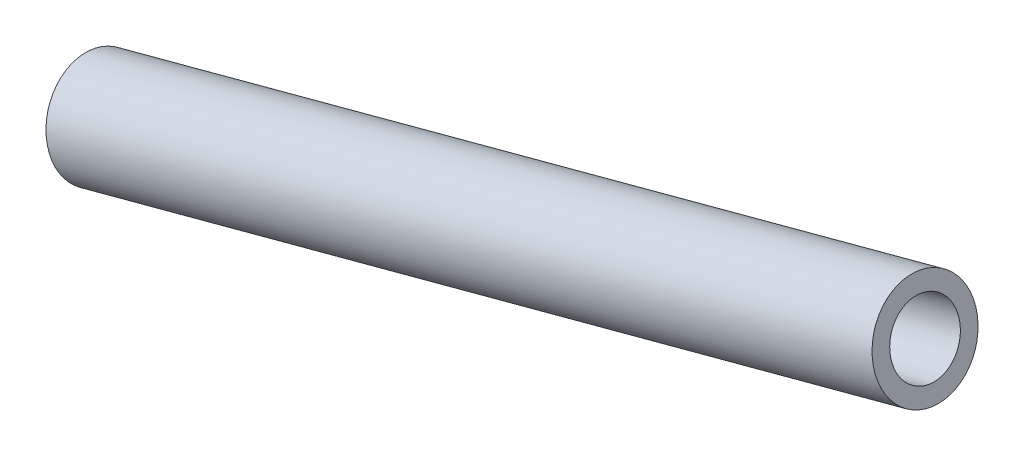
ISO-10303-21;
HEADER;
FILE_DESCRIPTION(('STEP AP214'),'2;1');
FILE_NAME('part.step','',(''),(''),'','','');
FILE_SCHEMA(('AUTOMOTIVE_DESIGN { 1 0 10303 214 1 1 1 1 }'));
ENDSEC;
DATA;
#1=APPLICATION_CONTEXT('core data for automotive mechanical design processes');
#2=APPLICATION_PROTOCOL_DEFINITION('international standard','automotive_design',2000,#1);
#3=PRODUCT_CONTEXT('',#1,'mechanical');
#4=PRODUCT('Part','Part','',(#3));
#5=PRODUCT_RELATED_PRODUCT_CATEGORY('part','',(#4));
#6=PRODUCT_DEFINITION_FORMATION('','',#4);
#7=PRODUCT_DEFINITION_CONTEXT('part definition',#1,'design');
#8=PRODUCT_DEFINITION('design','',#6,#7);
#9=PRODUCT_DEFINITION_SHAPE('','',#8);
#10=(LENGTH_UNIT() NAMED_UNIT(*) SI_UNIT(.MILLI.,.METRE.));
#11=(NAMED_UNIT(*) PLANE_ANGLE_UNIT() SI_UNIT($,.RADIAN.));
#12=(NAMED_UNIT(*) SI_UNIT($,.STERADIAN.) SOLID_ANGLE_UNIT());
#13=UNCERTAINTY_MEASURE_WITH_UNIT(LENGTH_MEASURE(1.E-05),#10,'distance_accuracy_value','');
#14=(GEOMETRIC_REPRESENTATION_CONTEXT(3) GLOBAL_UNCERTAINTY_ASSIGNED_CONTEXT((#13)) GLOBAL_UNIT_ASSIGNED_CONTEXT((#10,
#11,#12)) REPRESENTATION_CONTEXT('',''));
#15=CARTESIAN_POINT('',(0.,0.,0.));
#16=DIRECTION('',(0.,0.,1.));
#17=DIRECTION('',(1.,0.,0.));
#18=AXIS2_PLACEMENT_3D('',#15,#16,#17);
#19=CARTESIAN_POINT('',(-74.1250640941087,-48.9447461909407,56.5778660464695));
#20=DIRECTION('',(-0.96592582628907,-0.258819045102516,0.));
#21=DIRECTION('',(0.258819045102516,-0.96592582628907,0.));
#22=AXIS2_PLACEMENT_3D('',#19,#20,#21);
#23=PLANE('',#22);
#24=CARTESIAN_POINT('',(-74.1250640941087,-48.9447461909407,56.5778660464695));
#25=DIRECTION('',(-0.96592582628907,-0.258819045102516,0.));
#26=DIRECTION('',(0.258819045102516,-0.96592582628907,0.));
#27=AXIS2_PLACEMENT_3D('',#24,#25,#26);
#28=CIRCLE('',#27,3.);
#29=CARTESIAN_POINT('',(-73.3486069588011,-51.8425236698079,56.5778660464695));
#30=VERTEX_POINT('',#29);
#31=EDGE_CURVE('E10',#30,#30,#28,.T.);
#32=ORIENTED_EDGE('',*,*,#31,.T.);
#33=EDGE_LOOP('',(#32));
#34=FACE_BOUND('',#33,.T.);
#35=CARTESIAN_POINT('',(-74.1250640941087,-48.9447461909407,56.5778660464695));
#36=DIRECTION('',(-0.96592582628907,-0.258819045102516,0.));
#37=DIRECTION('',(0.258819045102516,-0.96592582628907,0.));
#38=AXIS2_PLACEMENT_3D('',#35,#36,#37);
#39=CIRCLE('',#38,2.);
#40=CARTESIAN_POINT('',(-73.6074260039036,-50.8765978435188,56.5778660464695));
#41=VERTEX_POINT('',#40);
#42=EDGE_CURVE('E48',#41,#41,#39,.T.);
#43=ORIENTED_EDGE('',*,*,#42,.F.);
#44=EDGE_LOOP('',(#43));
#45=FACE_BOUND('',#44,.T.);
#46=ADVANCED_FACE('F40',(#34,#45),#23,.T.);
#47=CARTESIAN_POINT('',(-25.8287727796552,-36.0037939358149,56.5778660464695));
#48=DIRECTION('',(-0.96592582628907,-0.258819045102516,0.));
#49=DIRECTION('',(0.258819045102516,-0.96592582628907,0.));
#50=AXIS2_PLACEMENT_3D('',#47,#48,#49);
#51=PLANE('',#50);
#52=CARTESIAN_POINT('',(-25.8287727796552,-36.0037939358149,56.5778660464695));
#53=DIRECTION('',(-0.96592582628907,-0.258819045102516,0.));
#54=DIRECTION('',(0.258819045102516,-0.96592582628907,0.));
#55=AXIS2_PLACEMENT_3D('',#52,#53,#54);
#56=CIRCLE('',#55,3.);
#57=CARTESIAN_POINT('',(-25.0523156443476,-38.9015714146821,56.5778660464695));
#58=VERTEX_POINT('',#57);
#59=EDGE_CURVE('E41',#58,#58,#56,.T.);
#60=ORIENTED_EDGE('',*,*,#59,.F.);
#61=EDGE_LOOP('',(#60));
#62=FACE_BOUND('',#61,.T.);
#63=CARTESIAN_POINT('',(-25.8287727796552,-36.0037939358149,56.5778660464695));
#64=DIRECTION('',(-0.96592582628907,-0.258819045102516,0.));
#65=DIRECTION('',(0.258819045102516,-0.96592582628907,0.));
#66=AXIS2_PLACEMENT_3D('',#63,#64,#65);
#67=CIRCLE('',#66,2.);
#68=CARTESIAN_POINT('',(-25.3111346894502,-37.935645588393,56.5778660464695));
#69=VERTEX_POINT('',#68);
#70=EDGE_CURVE('E49',#69,#69,#67,.T.);
#71=ORIENTED_EDGE('',*,*,#70,.T.);
#72=EDGE_LOOP('',(#71));
#73=FACE_BOUND('',#72,.T.);
#74=ADVANCED_FACE('F58',(#62,#73),#51,.F.);
#75=CARTESIAN_POINT('',(-74.1250640941087,-48.9447461909407,56.5778660464695));
#76=DIRECTION('',(0.96592582628907,0.258819045102516,0.));
#77=DIRECTION('',(-0.258819045102516,0.96592582628907,0.));
#78=AXIS2_PLACEMENT_3D('',#75,#76,#77);
#79=CYLINDRICAL_SURFACE('',#78,3.);
#80=ORIENTED_EDGE('',*,*,#31,.F.);
#81=EDGE_LOOP('',(#80));
#82=FACE_BOUND('',#81,.T.);
#83=ORIENTED_EDGE('',*,*,#59,.T.);
#84=EDGE_LOOP('',(#83));
#85=FACE_BOUND('',#84,.T.);
#86=ADVANCED_FACE('F39',(#82,#85),#79,.T.);
#87=CARTESIAN_POINT('',(-74.1250640941087,-48.9447461909407,56.5778660464695));
#88=DIRECTION('',(0.96592582628907,0.258819045102516,0.));
#89=DIRECTION('',(-0.258819045102516,0.96592582628907,0.));
#90=AXIS2_PLACEMENT_3D('',#87,#88,#89);
#91=CYLINDRICAL_SURFACE('',#90,2.);
#92=ORIENTED_EDGE('',*,*,#42,.T.);
#93=EDGE_LOOP('',(#92));
#94=FACE_BOUND('',#93,.T.);
#95=ORIENTED_EDGE('',*,*,#70,.F.);
#96=EDGE_LOOP('',(#95));
#97=FACE_BOUND('',#96,.T.);
#98=ADVANCED_FACE('F57',(#94,#97),#91,.F.);
#99=CLOSED_SHELL('',(#46,#74,#86,#98));
#100=MANIFOLD_SOLID_BREP('B2',#99);
#101=ADVANCED_BREP_SHAPE_REPRESENTATION('',(#18,#100),#14);
#102=SHAPE_DEFINITION_REPRESENTATION(#9,#101);
ENDSEC;
END-ISO-10303-21;
